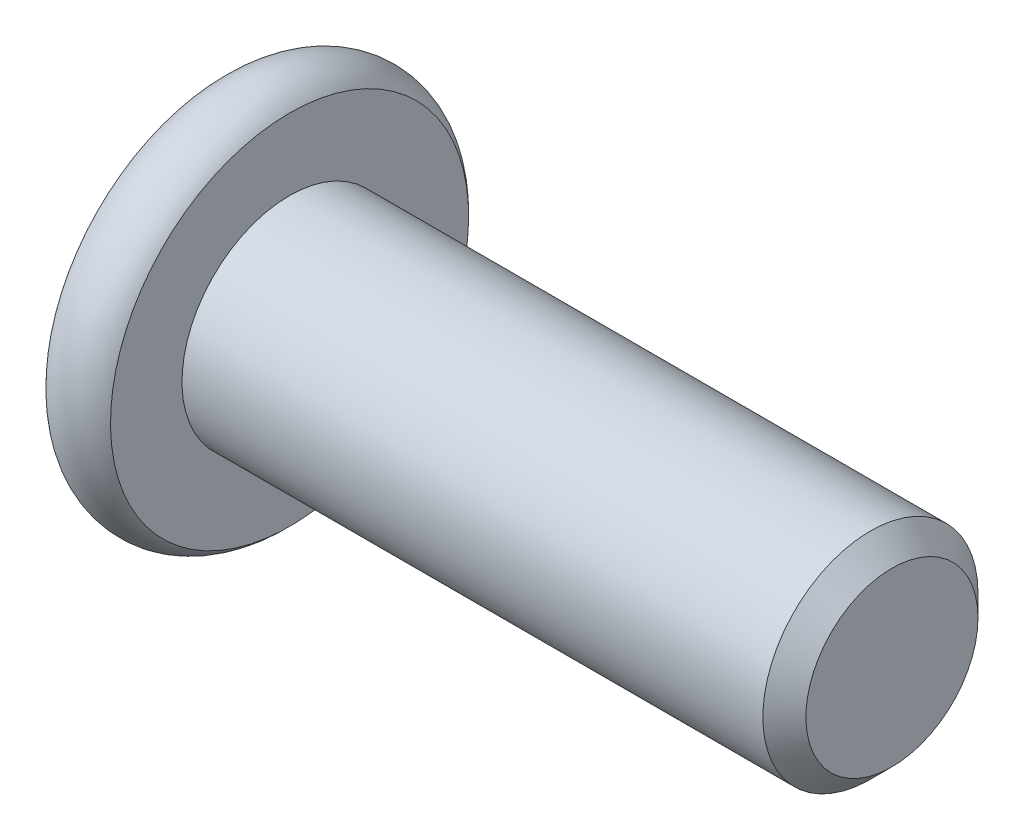
ISO-10303-21;
HEADER;
FILE_DESCRIPTION(('STEP AP214'),'2;1');
FILE_NAME('part.step','',(''),(''),'','','');
FILE_SCHEMA(('AUTOMOTIVE_DESIGN { 1 0 10303 214 1 1 1 1 }'));
ENDSEC;
DATA;
#1=APPLICATION_CONTEXT('core data for automotive mechanical design processes');
#2=APPLICATION_PROTOCOL_DEFINITION('international standard','automotive_design',2000,#1);
#3=PRODUCT_CONTEXT('',#1,'mechanical');
#4=PRODUCT('Part','Part','',(#3));
#5=PRODUCT_RELATED_PRODUCT_CATEGORY('part','',(#4));
#6=PRODUCT_DEFINITION_FORMATION('','',#4);
#7=PRODUCT_DEFINITION_CONTEXT('part definition',#1,'design');
#8=PRODUCT_DEFINITION('design','',#6,#7);
#9=PRODUCT_DEFINITION_SHAPE('','',#8);
#10=(LENGTH_UNIT() NAMED_UNIT(*) SI_UNIT(.MILLI.,.METRE.));
#11=(NAMED_UNIT(*) PLANE_ANGLE_UNIT() SI_UNIT($,.RADIAN.));
#12=(NAMED_UNIT(*) SI_UNIT($,.STERADIAN.) SOLID_ANGLE_UNIT());
#13=UNCERTAINTY_MEASURE_WITH_UNIT(LENGTH_MEASURE(1.E-05),#10,'distance_accuracy_value','');
#14=(GEOMETRIC_REPRESENTATION_CONTEXT(3) GLOBAL_UNCERTAINTY_ASSIGNED_CONTEXT((#13)) GLOBAL_UNIT_ASSIGNED_CONTEXT((#10,
#11,#12)) REPRESENTATION_CONTEXT('',''));
#15=CARTESIAN_POINT('',(0.,0.,0.));
#16=DIRECTION('',(0.,0.,1.));
#17=DIRECTION('',(1.,0.,0.));
#18=AXIS2_PLACEMENT_3D('',#15,#16,#17);
#19=CARTESIAN_POINT('',(-14.,0.,0.));
#20=DIRECTION('',(1.,0.,0.));
#21=DIRECTION('',(0.,0.,-1.));
#22=AXIS2_PLACEMENT_3D('',#19,#20,#21);
#23=CYLINDRICAL_SURFACE('',#22,2.5);
#24=CARTESIAN_POINT('',(-0.500000000000006,0.,0.));
#25=DIRECTION('',(1.,0.,0.));
#26=DIRECTION('',(0.,0.,-1.));
#27=AXIS2_PLACEMENT_3D('',#24,#25,#26);
#28=CIRCLE('',#27,2.5);
#29=CARTESIAN_POINT('',(-0.500000000000006,0.,-2.5));
#30=VERTEX_POINT('',#29);
#31=EDGE_CURVE('E55',#30,#30,#28,.F.);
#32=ORIENTED_EDGE('',*,*,#31,.T.);
#33=EDGE_LOOP('',(#32));
#34=FACE_BOUND('',#33,.T.);
#35=CARTESIAN_POINT('',(-14.,0.,0.));
#36=DIRECTION('',(1.,0.,0.));
#37=DIRECTION('',(0.,1.,0.));
#38=AXIS2_PLACEMENT_3D('',#35,#36,#37);
#39=CIRCLE('',#38,2.5);
#40=CARTESIAN_POINT('',(-14.,2.49999999999999,0.));
#41=VERTEX_POINT('',#40);
#42=EDGE_CURVE('E131',#41,#41,#39,.F.);
#43=ORIENTED_EDGE('',*,*,#42,.F.);
#44=EDGE_LOOP('',(#43));
#45=FACE_BOUND('',#44,.T.);
#46=ADVANCED_FACE('F41',(#34,#45),#23,.T.);
#47=CARTESIAN_POINT('',(0.,0.,0.));
#48=DIRECTION('',(1.,0.,0.));
#49=DIRECTION('',(0.,0.,-1.));
#50=AXIS2_PLACEMENT_3D('',#47,#48,#49);
#51=PLANE('',#50);
#52=CARTESIAN_POINT('',(0.,0.,0.));
#53=DIRECTION('',(1.,0.,0.));
#54=DIRECTION('',(0.,0.,-1.));
#55=AXIS2_PLACEMENT_3D('',#52,#53,#54);
#56=CIRCLE('',#55,1.99999999999999);
#57=CARTESIAN_POINT('',(0.,0.,-1.99999999999999));
#58=VERTEX_POINT('',#57);
#59=EDGE_CURVE('E134',#58,#58,#56,.T.);
#60=ORIENTED_EDGE('',*,*,#59,.T.);
#61=EDGE_LOOP('',(#60));
#62=FACE_BOUND('',#61,.T.);
#63=ADVANCED_FACE('F144',(#62),#51,.T.);
#64=CARTESIAN_POINT('',(0.,0.,0.));
#65=DIRECTION('',(-1.,0.,0.));
#66=DIRECTION('',(0.,0.,1.));
#67=AXIS2_PLACEMENT_3D('',#64,#65,#66);
#68=CONICAL_SURFACE('',#67,1.99999999999999,0.785398163397446);
#69=ORIENTED_EDGE('',*,*,#31,.F.);
#70=EDGE_LOOP('',(#69));
#71=FACE_BOUND('',#70,.T.);
#72=ORIENTED_EDGE('',*,*,#59,.F.);
#73=EDGE_LOOP('',(#72));
#74=FACE_BOUND('',#73,.T.);
#75=ADVANCED_FACE('F43',(#71,#74),#68,.T.);
#76=CARTESIAN_POINT('',(-15.5,0.,0.));
#77=DIRECTION('',(-1.,0.,0.));
#78=DIRECTION('',(0.,-1.,0.));
#79=AXIS2_PLACEMENT_3D('',#76,#77,#78);
#80=PLANE('',#79);
#81=CARTESIAN_POINT('',(-15.5,0.,0.));
#82=DIRECTION('',(-1.,0.,0.));
#83=DIRECTION('',(0.,-1.,0.));
#84=AXIS2_PLACEMENT_3D('',#81,#82,#83);
#85=CIRCLE('',#84,1.78205080756884);
#86=CARTESIAN_POINT('',(-15.5,-1.78205080756878,0.));
#87=VERTEX_POINT('',#86);
#88=EDGE_CURVE('E249',#87,#87,#85,.T.);
#89=ORIENTED_EDGE('',*,*,#88,.F.);
#90=EDGE_LOOP('',(#89));
#91=FACE_BOUND('',#90,.T.);
#92=CARTESIAN_POINT('',(-15.5,0.,0.));
#93=DIRECTION('',(1.,0.,0.));
#94=DIRECTION('',(0.,1.,0.));
#95=AXIS2_PLACEMENT_3D('',#92,#93,#94);
#96=CIRCLE('',#95,4.16143782776615);
#97=CARTESIAN_POINT('',(-15.5,4.16143782776615,0.));
#98=VERTEX_POINT('',#97);
#99=EDGE_CURVE('E128',#98,#98,#96,.T.);
#100=ORIENTED_EDGE('',*,*,#99,.F.);
#101=EDGE_LOOP('',(#100));
#102=FACE_BOUND('',#101,.T.);
#103=ADVANCED_FACE('F143',(#91,#102),#80,.T.);
#104=CARTESIAN_POINT('',(-14.75,0.,0.));
#105=DIRECTION('',(1.,0.,0.));
#106=DIRECTION('',(0.,1.,0.));
#107=AXIS2_PLACEMENT_3D('',#104,#105,#106);
#108=TOROIDAL_SURFACE('',#107,3.5,1.);
#109=ORIENTED_EDGE('',*,*,#99,.T.);
#110=EDGE_LOOP('',(#109));
#111=FACE_BOUND('',#110,.T.);
#112=CARTESIAN_POINT('',(-14.,0.,0.));
#113=DIRECTION('',(1.,0.,0.));
#114=DIRECTION('',(0.,1.,0.));
#115=AXIS2_PLACEMENT_3D('',#112,#113,#114);
#116=CIRCLE('',#115,4.16143782776615);
#117=CARTESIAN_POINT('',(-14.,4.16143782776615,0.));
#118=VERTEX_POINT('',#117);
#119=EDGE_CURVE('E125',#118,#118,#116,.T.);
#120=ORIENTED_EDGE('',*,*,#119,.F.);
#121=EDGE_LOOP('',(#120));
#122=FACE_BOUND('',#121,.T.);
#123=ADVANCED_FACE('F155',(#111,#122),#108,.T.);
#124=CARTESIAN_POINT('',(-14.,4.16143782776615,0.));
#125=DIRECTION('',(1.,0.,0.));
#126=DIRECTION('',(0.,1.,0.));
#127=AXIS2_PLACEMENT_3D('',#124,#125,#126);
#128=PLANE('',#127);
#129=ORIENTED_EDGE('',*,*,#42,.T.);
#130=EDGE_LOOP('',(#129));
#131=FACE_BOUND('',#130,.T.);
#132=ORIENTED_EDGE('',*,*,#119,.T.);
#133=EDGE_LOOP('',(#132));
#134=FACE_BOUND('',#133,.T.);
#135=ADVANCED_FACE('F159',(#131,#134),#128,.T.);
#136=CARTESIAN_POINT('',(-15.5,0.,0.));
#137=DIRECTION('',(-1.,0.,0.));
#138=DIRECTION('',(0.,-1.,0.));
#139=AXIS2_PLACEMENT_3D('',#136,#137,#138);
#140=CONICAL_SURFACE('',#139,1.78205080756884,0.78539816339745);
#141=ORIENTED_EDGE('',*,*,#88,.T.);
#142=EDGE_LOOP('',(#141));
#143=FACE_BOUND('',#142,.T.);
#144=CARTESIAN_POINT('',(-16.015428085613,-1.74023253176574,1.5));
#145=CARTESIAN_POINT('',(-15.9833811073445,-1.69791724929728,1.5));
#146=CARTESIAN_POINT('',(-15.9516444672841,-1.65536760966789,1.5));
#147=CARTESIAN_POINT('',(-15.8889203936153,-1.56970398156682,1.5));
#148=CARTESIAN_POINT('',(-15.85793314822,-1.52658985542846,1.5));
#149=CARTESIAN_POINT('',(-15.765846164345,-1.39562626326561,1.5));
#150=CARTESIAN_POINT('',(-15.7061145123021,-1.30679868010573,1.5));
#151=CARTESIAN_POINT('',(-15.5887342891012,-1.12044622640212,1.5));
#152=CARTESIAN_POINT('',(-15.5314082774823,-1.0227158730667,1.5));
#153=CARTESIAN_POINT('',(-15.426463214976,-0.822357214965234,1.5));
#154=CARTESIAN_POINT('',(-15.3788114236896,-0.719746931701897,1.5));
#155=CARTESIAN_POINT('',(-15.320509988315,-0.565852387095071,1.5));
#156=CARTESIAN_POINT('',(-15.3037990535409,-0.516874191424659,1.5));
#157=CARTESIAN_POINT('',(-15.2743077515089,-0.417723988457498,1.5));
#158=CARTESIAN_POINT('',(-15.2615276514219,-0.367551900263865,1.5));
#159=CARTESIAN_POINT('',(-15.2407784202458,-0.267158299056116,1.5));
#160=CARTESIAN_POINT('',(-15.2327260618259,-0.216954261864853,1.5));
#161=CARTESIAN_POINT('',(-15.221591636834,-0.115994915871319,1.5));
#162=CARTESIAN_POINT('',(-15.2185086886377,-0.0652397064615366,1.5));
#163=CARTESIAN_POINT('',(-15.2175473897404,0.034422223487559,1.5));
#164=CARTESIAN_POINT('',(-15.2194789216952,0.083327170110093,1.5));
#165=CARTESIAN_POINT('',(-15.2280175729677,0.180724293127225,1.5));
#166=CARTESIAN_POINT('',(-15.234625142048,0.229216429361733,1.5));
#167=CARTESIAN_POINT('',(-15.2522650626447,0.326258027697012,1.5));
#168=CARTESIAN_POINT('',(-15.263373168201,0.374793507450032,1.5));
#169=CARTESIAN_POINT('',(-15.2894198669595,0.470802295834186,1.5));
#170=CARTESIAN_POINT('',(-15.3043581560035,0.518275688481289,1.5));
#171=CARTESIAN_POINT('',(-15.356839545716,0.667150562065138,1.5));
#172=CARTESIAN_POINT('',(-15.4003351165442,0.766448362426858,1.5));
#173=CARTESIAN_POINT('',(-15.4970587814836,0.960384405673845,1.5));
#174=CARTESIAN_POINT('',(-15.5503217226675,1.05500437383622,1.5));
#175=CARTESIAN_POINT('',(-15.6602258010454,1.23584520321533,1.5));
#176=CARTESIAN_POINT('',(-15.7165682531046,1.32224986946551,1.5));
#177=CARTESIAN_POINT('',(-15.803675572597,1.44954953726474,1.5));
#178=CARTESIAN_POINT('',(-15.8330199906839,1.49143368482424,1.5));
#179=CARTESIAN_POINT('',(-15.8924869182931,1.57462914783245,1.5));
#180=CARTESIAN_POINT('',(-15.9226092115007,1.6159406177258,1.5));
#181=CARTESIAN_POINT('',(-15.9530541181366,1.65701358742554,1.5));
#182=B_SPLINE_CURVE_WITH_KNOTS('',3,(#144,#145,#146,#147,#148,#149,#150,#151,#152,#153,#154,
#155,#156,#157,#158,#159,#160,#161,#162,#163,#164,#165,#166,#167,#168,#169,#170,#171,#172,#173,
#174,#175,#176,#177,#178,#179,#180,#181),.UNSPECIFIED.,.F.,.F.,(4,2,2,2,2,2,2,2,2,2,2,2,2,2,2,2,
2,2,4),(0.,0.159238974218353,0.318517535014539,0.639504781932382,0.97913789379919,
1.31760168934356,1.47272233841623,1.62785352839774,1.78016486537345,1.93244917778278,
2.07904486260296,2.22565464958331,2.37484213303397,2.52401777304038,2.84828365283774,
3.17372975666748,3.48303030530535,3.63644667013907,3.78982082222911),.UNSPECIFIED.);
#183=CARTESIAN_POINT('',(-15.45,-0.86602540378438,1.5));
#184=VERTEX_POINT('',#183);
#185=CARTESIAN_POINT('',(-15.45,0.866025403784498,1.5));
#186=VERTEX_POINT('',#185);
#187=EDGE_CURVE('E109',#184,#186,#182,.T.);
#188=ORIENTED_EDGE('',*,*,#187,.F.);
#189=CARTESIAN_POINT('',(-15.4501154816001,-1.73216627762266,-0.000200000000000743));
#190=CARTESIAN_POINT('',(-15.4203654760674,-1.70239359975909,0.0513677907370745));
#191=CARTESIAN_POINT('',(-15.3923624839103,-1.67212305186349,0.1037979176652));
#192=CARTESIAN_POINT('',(-15.3410892304402,-1.61039789003613,0.210709034055596));
#193=CARTESIAN_POINT('',(-15.3178475050444,-1.57893740312608,0.26520019581466));
#194=CARTESIAN_POINT('',(-15.2780337289923,-1.51549879897981,0.375079081357248));
#195=CARTESIAN_POINT('',(-15.2613615856709,-1.48353684526804,0.430438809095199));
#196=CARTESIAN_POINT('',(-15.2356744568181,-1.41890915196206,0.54237725747715));
#197=CARTESIAN_POINT('',(-15.2266402904789,-1.38624538781112,0.598952556553007));
#198=CARTESIAN_POINT('',(-15.2184890812269,-1.32995210095294,0.696455389516439));
#199=CARTESIAN_POINT('',(-15.2172822529892,-1.30639533311118,0.737256908280465));
#200=CARTESIAN_POINT('',(-15.2193140571623,-1.25932335290188,0.818787969615857));
#201=CARTESIAN_POINT('',(-15.2225536707483,-1.23580815085308,0.859517494314628));
#202=CARTESIAN_POINT('',(-15.233291985982,-1.18900414978421,0.940584402163415));
#203=CARTESIAN_POINT('',(-15.2407946530188,-1.16571558211714,0.980921384598287));
#204=CARTESIAN_POINT('',(-15.2596516119283,-1.11952932016329,1.06091833691403));
#205=CARTESIAN_POINT('',(-15.2710075570186,-1.0966317980878,1.10057800851621));
#206=CARTESIAN_POINT('',(-15.3047216475927,-1.03798159809693,1.20216313477448));
#207=CARTESIAN_POINT('',(-15.3296218490934,-1.00259267147459,1.26345855370969));
#208=CARTESIAN_POINT('',(-15.3716566532716,-0.950557780604316,1.35358562846331));
#209=CARTESIAN_POINT('',(-15.3864251535591,-0.933410759677089,1.38328513990772));
#210=CARTESIAN_POINT('',(-15.4173105659402,-0.899432101996348,1.44213790138375));
#211=CARTESIAN_POINT('',(-15.4334268341217,-0.882600319285652,1.47129140422064));
#212=CARTESIAN_POINT('',(-15.4501154816001,-0.865909933730542,1.5002));
#213=B_SPLINE_CURVE_WITH_KNOTS('',3,(#189,#190,#191,#192,#193,#194,#195,#196,#197,#198,#199,
#200,#201,#202,#203,#204,#205,#206,#207,#208,#209,#210,#211,#212),.UNSPECIFIED.,.F.,.F.,(4,2,2,
2,2,2,2,2,2,2,2,4),(0.,0.199829143693305,0.400822987382389,0.598623720538181,0.795926240188889,
0.937113067959881,1.07833105577193,1.21968061668222,1.36109089931054,1.58570969637565,
1.69770705470964,1.80965120737194),.UNSPECIFIED.);
#214=CARTESIAN_POINT('',(-15.45,-1.73205080756882,0.));
#215=VERTEX_POINT('',#214);
#216=EDGE_CURVE('E205',#215,#184,#213,.T.);
#217=ORIENTED_EDGE('',*,*,#216,.F.);
#218=CARTESIAN_POINT('',(-15.4501154816001,-0.865909933730541,-1.5002));
#219=CARTESIAN_POINT('',(-15.4203654760674,-0.895682611594106,-1.44863220926292));
#220=CARTESIAN_POINT('',(-15.3923624839103,-0.925953159489705,-1.3962020823348));
#221=CARTESIAN_POINT('',(-15.3410892304402,-0.987678321317064,-1.2892909659444));
#222=CARTESIAN_POINT('',(-15.3178475050444,-1.01913880822712,-1.23479980418534));
#223=CARTESIAN_POINT('',(-15.2780337289923,-1.08257741237338,-1.12492091864275));
#224=CARTESIAN_POINT('',(-15.2613615856709,-1.11453936608515,-1.0695611909048));
#225=CARTESIAN_POINT('',(-15.2356744568181,-1.17916705939114,-0.95762274252285));
#226=CARTESIAN_POINT('',(-15.2266402904789,-1.21183082354207,-0.901047443446992));
#227=CARTESIAN_POINT('',(-15.2184890812269,-1.26812411040026,-0.80354461048356));
#228=CARTESIAN_POINT('',(-15.2172822529892,-1.29168087824202,-0.762743091719535));
#229=CARTESIAN_POINT('',(-15.2193140571623,-1.33875285845132,-0.681212030384143));
#230=CARTESIAN_POINT('',(-15.2225536707483,-1.36226806050012,-0.640482505685371));
#231=CARTESIAN_POINT('',(-15.233291985982,-1.40907206156899,-0.559415597836585));
#232=CARTESIAN_POINT('',(-15.2407946530188,-1.43236062923606,-0.519078615401713));
#233=CARTESIAN_POINT('',(-15.2596516119283,-1.4785468911899,-0.439081663085971));
#234=CARTESIAN_POINT('',(-15.2710075570186,-1.50144441326539,-0.399421991483793));
#235=CARTESIAN_POINT('',(-15.3047216475927,-1.56009461325627,-0.297836865225516));
#236=CARTESIAN_POINT('',(-15.3296218490934,-1.5954835398786,-0.236541446290312));
#237=CARTESIAN_POINT('',(-15.3716566532716,-1.64751843074888,-0.146414371536687));
#238=CARTESIAN_POINT('',(-15.3864251535591,-1.66466545167611,-0.116714860092283));
#239=CARTESIAN_POINT('',(-15.4173105659402,-1.69864410935685,-0.0578620986162489));
#240=CARTESIAN_POINT('',(-15.4334268341217,-1.71547589206755,-0.0287085957793625));
#241=CARTESIAN_POINT('',(-15.4501154816001,-1.73216627762266,0.000200000000000135));
#242=B_SPLINE_CURVE_WITH_KNOTS('',3,(#218,#219,#220,#221,#222,#223,#224,#225,#226,#227,#228,
#229,#230,#231,#232,#233,#234,#235,#236,#237,#238,#239,#240,#241),.UNSPECIFIED.,.F.,.F.,(4,2,2,
2,2,2,2,2,2,2,2,4),(0.,0.199829143693305,0.400822987382388,0.59862372053818,0.795926240188888,
0.93711306795988,1.07833105577193,1.21968061668222,1.36109089931054,1.58570969637565,
1.69770705470964,1.80965120737194),.UNSPECIFIED.);
#243=CARTESIAN_POINT('',(-15.45,-0.866025403784379,-1.5));
#244=VERTEX_POINT('',#243);
#245=EDGE_CURVE('E199',#244,#215,#242,.T.);
#246=ORIENTED_EDGE('',*,*,#245,.F.);
#247=CARTESIAN_POINT('',(-16.015428085613,-1.74023253176574,-1.5));
#248=CARTESIAN_POINT('',(-15.9833811073445,-1.69791724929728,-1.5));
#249=CARTESIAN_POINT('',(-15.9516444672841,-1.65536760966789,-1.5));
#250=CARTESIAN_POINT('',(-15.8889203936153,-1.56970398156682,-1.5));
#251=CARTESIAN_POINT('',(-15.85793314822,-1.52658985542846,-1.5));
#252=CARTESIAN_POINT('',(-15.765846164345,-1.3956262632656,-1.5));
#253=CARTESIAN_POINT('',(-15.7061145123021,-1.30679868010573,-1.5));
#254=CARTESIAN_POINT('',(-15.5887342891012,-1.12044622640212,-1.5));
#255=CARTESIAN_POINT('',(-15.5314082774823,-1.0227158730667,-1.5));
#256=CARTESIAN_POINT('',(-15.426463214976,-0.822357214965232,-1.5));
#257=CARTESIAN_POINT('',(-15.3788114236896,-0.719746931701896,-1.5));
#258=CARTESIAN_POINT('',(-15.320509988315,-0.565852387095069,-1.5));
#259=CARTESIAN_POINT('',(-15.3037990535409,-0.516874191424658,-1.5));
#260=CARTESIAN_POINT('',(-15.2743077515089,-0.417723988457497,-1.5));
#261=CARTESIAN_POINT('',(-15.2615276514219,-0.367551900263864,-1.5));
#262=CARTESIAN_POINT('',(-15.2407784202458,-0.267158299056116,-1.5));
#263=CARTESIAN_POINT('',(-15.2327260618259,-0.216954261864852,-1.5));
#264=CARTESIAN_POINT('',(-15.221591636834,-0.115994915871318,-1.5));
#265=CARTESIAN_POINT('',(-15.2185086886377,-0.0652397064615364,-1.5));
#266=CARTESIAN_POINT('',(-15.2175473897404,0.0344222234875589,-1.5));
#267=CARTESIAN_POINT('',(-15.2194789216952,0.0833271701100929,-1.5));
#268=CARTESIAN_POINT('',(-15.2280175729677,0.180724293127225,-1.5));
#269=CARTESIAN_POINT('',(-15.234625142048,0.229216429361733,-1.5));
#270=CARTESIAN_POINT('',(-15.2522650626447,0.326258027697012,-1.5));
#271=CARTESIAN_POINT('',(-15.263373168201,0.374793507450032,-1.5));
#272=CARTESIAN_POINT('',(-15.2894198669595,0.470802295834185,-1.5));
#273=CARTESIAN_POINT('',(-15.3043581560035,0.518275688481288,-1.5));
#274=CARTESIAN_POINT('',(-15.356839545716,0.667150562065137,-1.5));
#275=CARTESIAN_POINT('',(-15.4003351165442,0.766448362426856,-1.5));
#276=CARTESIAN_POINT('',(-15.4970587814836,0.960384405673843,-1.5));
#277=CARTESIAN_POINT('',(-15.5503217226675,1.05500437383622,-1.5));
#278=CARTESIAN_POINT('',(-15.6602258010454,1.23584520321533,-1.5));
#279=CARTESIAN_POINT('',(-15.7165682531046,1.32224986946551,-1.5));
#280=CARTESIAN_POINT('',(-15.803675572597,1.44954953726474,-1.5));
#281=CARTESIAN_POINT('',(-15.8330199906839,1.49143368482424,-1.5));
#282=CARTESIAN_POINT('',(-15.8924869182931,1.57462914783245,-1.5));
#283=CARTESIAN_POINT('',(-15.9226092115007,1.6159406177258,-1.5));
#284=CARTESIAN_POINT('',(-15.9530541181366,1.65701358742554,-1.5));
#285=B_SPLINE_CURVE_WITH_KNOTS('',3,(#247,#248,#249,#250,#251,#252,#253,#254,#255,#256,#257,
#258,#259,#260,#261,#262,#263,#264,#265,#266,#267,#268,#269,#270,#271,#272,#273,#274,#275,#276,
#277,#278,#279,#280,#281,#282,#283,#284),.UNSPECIFIED.,.F.,.F.,(4,2,2,2,2,2,2,2,2,2,2,2,2,2,2,2,
2,2,4),(0.,0.159238974218351,0.31851753501454,0.639504781932383,0.979137893799188,
1.31760168934356,1.47272233841622,1.62785352839774,1.78016486537345,1.93244917778277,
2.07904486260295,2.2256546495833,2.37484213303397,2.52401777304037,2.84828365283773,
3.17372975666748,3.48303030530535,3.63644667013906,3.7898208222291),.UNSPECIFIED.);
#286=CARTESIAN_POINT('',(-15.45,0.866025403784498,-1.5));
#287=VERTEX_POINT('',#286);
#288=EDGE_CURVE('E62',#287,#244,#285,.F.);
#289=ORIENTED_EDGE('',*,*,#288,.F.);
#290=CARTESIAN_POINT('',(-15.4501154816001,1.73216627762277,0.000200000000000631));
#291=CARTESIAN_POINT('',(-15.4203654760673,1.70239359975921,-0.051367790737075));
#292=CARTESIAN_POINT('',(-15.3923624839103,1.67212305186361,-0.1037979176652));
#293=CARTESIAN_POINT('',(-15.3410892304402,1.61039789003625,-0.210709034055596));
#294=CARTESIAN_POINT('',(-15.3178475050444,1.5789374031262,-0.265200195814661));
#295=CARTESIAN_POINT('',(-15.2780337289922,1.51549879897993,-0.375079081357248));
#296=CARTESIAN_POINT('',(-15.2613615856709,1.48353684526816,-0.430438809095199));
#297=CARTESIAN_POINT('',(-15.2356744568181,1.41890915196217,-0.542377257477151));
#298=CARTESIAN_POINT('',(-15.2266402904789,1.38624538781124,-0.598952556553009));
#299=CARTESIAN_POINT('',(-15.2184890812269,1.32995210095305,-0.696455389516441));
#300=CARTESIAN_POINT('',(-15.2172822529892,1.3063953331113,-0.737256908280466));
#301=CARTESIAN_POINT('',(-15.2193140571623,1.25932335290199,-0.818787969615858));
#302=CARTESIAN_POINT('',(-15.2225536707483,1.23580815085319,-0.85951749431463));
#303=CARTESIAN_POINT('',(-15.233291985982,1.18900414978432,-0.940584402163416));
#304=CARTESIAN_POINT('',(-15.2407946530188,1.16571558211725,-0.980921384598288));
#305=CARTESIAN_POINT('',(-15.2596516119283,1.11952932016341,-1.06091833691403));
#306=CARTESIAN_POINT('',(-15.2710075570186,1.09663179808792,-1.10057800851621));
#307=CARTESIAN_POINT('',(-15.3047216475927,1.03798159809704,-1.20216313477448));
#308=CARTESIAN_POINT('',(-15.3296218490934,1.00259267147471,-1.26345855370969));
#309=CARTESIAN_POINT('',(-15.3716566532716,0.950557780604434,-1.35358562846331));
#310=CARTESIAN_POINT('',(-15.3864251535591,0.933410759677207,-1.38328513990772));
#311=CARTESIAN_POINT('',(-15.4173105659402,0.899432101996466,-1.44213790138375));
#312=CARTESIAN_POINT('',(-15.4334268341217,0.88260031928577,-1.47129140422064));
#313=CARTESIAN_POINT('',(-15.4501154816001,0.865909933730661,-1.5002));
#314=B_SPLINE_CURVE_WITH_KNOTS('',3,(#290,#291,#292,#293,#294,#295,#296,#297,#298,#299,#300,
#301,#302,#303,#304,#305,#306,#307,#308,#309,#310,#311,#312,#313),.UNSPECIFIED.,.F.,.F.,(4,2,2,
2,2,2,2,2,2,2,2,4),(0.,0.199829143693305,0.400822987382389,0.598623720538182,0.79592624018889,
0.937113067959882,1.07833105577193,1.21968061668222,1.36109089931055,1.58570969637566,
1.69770705470964,1.80965120737194),.UNSPECIFIED.);
#315=CARTESIAN_POINT('',(-15.45,1.73205080756894,0.));
#316=VERTEX_POINT('',#315);
#317=EDGE_CURVE('E11',#316,#287,#314,.T.);
#318=ORIENTED_EDGE('',*,*,#317,.F.);
#319=CARTESIAN_POINT('',(-15.4501154816001,0.86590993373066,1.5002));
#320=CARTESIAN_POINT('',(-15.4203654760674,0.895682611594225,1.44863220926292));
#321=CARTESIAN_POINT('',(-15.3923624839103,0.925953159489824,1.3962020823348));
#322=CARTESIAN_POINT('',(-15.3410892304402,0.987678321317183,1.2892909659444));
#323=CARTESIAN_POINT('',(-15.3178475050444,1.01913880822723,1.23479980418534));
#324=CARTESIAN_POINT('',(-15.2780337289922,1.0825774123735,1.12492091864275));
#325=CARTESIAN_POINT('',(-15.2613615856709,1.11453936608527,1.0695611909048));
#326=CARTESIAN_POINT('',(-15.2356744568181,1.17916705939126,0.957622742522848));
#327=CARTESIAN_POINT('',(-15.2266402904789,1.21183082354219,0.90104744344699));
#328=CARTESIAN_POINT('',(-15.2184890812269,1.26812411040038,0.803544610483558));
#329=CARTESIAN_POINT('',(-15.2172822529892,1.29168087824214,0.762743091719532));
#330=CARTESIAN_POINT('',(-15.2193140571623,1.33875285845144,0.68121203038414));
#331=CARTESIAN_POINT('',(-15.2225536707483,1.36226806050024,0.640482505685369));
#332=CARTESIAN_POINT('',(-15.233291985982,1.40907206156911,0.559415597836583));
#333=CARTESIAN_POINT('',(-15.2407946530188,1.43236062923618,0.519078615401711));
#334=CARTESIAN_POINT('',(-15.2596516119283,1.47854689119002,0.439081663085968));
#335=CARTESIAN_POINT('',(-15.2710075570186,1.50144441326551,0.399421991483791));
#336=CARTESIAN_POINT('',(-15.3047216475927,1.56009461325639,0.297836865225514));
#337=CARTESIAN_POINT('',(-15.3296218490934,1.59548353987872,0.236541446290311));
#338=CARTESIAN_POINT('',(-15.3716566532716,1.647518430749,0.146414371536687));
#339=CARTESIAN_POINT('',(-15.3864251535591,1.66466545167623,0.116714860092283));
#340=CARTESIAN_POINT('',(-15.4173105659402,1.69864410935697,0.0578620986162501));
#341=CARTESIAN_POINT('',(-15.4334268341217,1.71547589206766,0.0287085957793638));
#342=CARTESIAN_POINT('',(-15.4501154816001,1.73216627762277,-0.000199999999998915));
#343=B_SPLINE_CURVE_WITH_KNOTS('',3,(#319,#320,#321,#322,#323,#324,#325,#326,#327,#328,#329,
#330,#331,#332,#333,#334,#335,#336,#337,#338,#339,#340,#341,#342),.UNSPECIFIED.,.F.,.F.,(4,2,2,
2,2,2,2,2,2,2,2,4),(0.,0.199829143693305,0.400822987382389,0.598623720538182,0.79592624018889,
0.937113067959882,1.07833105577193,1.21968061668222,1.36109089931054,1.58570969637565,
1.69770705470963,1.80965120737193),.UNSPECIFIED.);
#344=EDGE_CURVE('E100',#186,#316,#343,.T.);
#345=ORIENTED_EDGE('',*,*,#344,.F.);
#346=EDGE_LOOP('',(#188,#217,#246,#289,#318,#345));
#347=FACE_BOUND('',#346,.T.);
#348=ADVANCED_FACE('F99',(#143,#347),#140,.F.);
#349=CARTESIAN_POINT('',(-13.2,0.,0.));
#350=DIRECTION('',(-1.,0.,0.));
#351=DIRECTION('',(0.,-1.,0.));
#352=AXIS2_PLACEMENT_3D('',#349,#350,#351);
#353=PLANE('',#352);
#354=DIRECTION('',(0.,0.5,-0.866025403784438));
#355=VECTOR('',#354,1.);
#356=CARTESIAN_POINT('',(-13.2,0.866025403784489,1.5));
#357=LINE('',#356,#355);
#358=CARTESIAN_POINT('',(-13.2,0.866025403784489,1.5));
#359=VERTEX_POINT('',#358);
#360=CARTESIAN_POINT('',(-13.2,1.73205080756893,0.));
#361=VERTEX_POINT('',#360);
#362=EDGE_CURVE('E108',#359,#361,#357,.T.);
#363=ORIENTED_EDGE('',*,*,#362,.T.);
#364=DIRECTION('',(0.,-0.5,-0.866025403784439));
#365=VECTOR('',#364,1.);
#366=CARTESIAN_POINT('',(-13.2,1.73205080756893,0.));
#367=LINE('',#366,#365);
#368=CARTESIAN_POINT('',(-13.2,0.866025403784489,-1.5));
#369=VERTEX_POINT('',#368);
#370=EDGE_CURVE('E113',#361,#369,#367,.T.);
#371=ORIENTED_EDGE('',*,*,#370,.T.);
#372=DIRECTION('',(0.,-1.,0.));
#373=VECTOR('',#372,1.);
#374=CARTESIAN_POINT('',(-13.2,0.866025403784489,-1.5));
#375=LINE('',#374,#373);
#376=CARTESIAN_POINT('',(-13.2,-0.866025403784388,-1.5));
#377=VERTEX_POINT('',#376);
#378=EDGE_CURVE('E231',#369,#377,#375,.T.);
#379=ORIENTED_EDGE('',*,*,#378,.T.);
#380=DIRECTION('',(0.,-0.5,0.866025403784438));
#381=VECTOR('',#380,1.);
#382=CARTESIAN_POINT('',(-13.2,-0.866025403784388,-1.5));
#383=LINE('',#382,#381);
#384=CARTESIAN_POINT('',(-13.2,-1.73205080756883,0.));
#385=VERTEX_POINT('',#384);
#386=EDGE_CURVE('E235',#377,#385,#383,.T.);
#387=ORIENTED_EDGE('',*,*,#386,.T.);
#388=DIRECTION('',(0.,0.5,0.866025403784439));
#389=VECTOR('',#388,1.);
#390=CARTESIAN_POINT('',(-13.2,-1.73205080756883,0.));
#391=LINE('',#390,#389);
#392=CARTESIAN_POINT('',(-13.2,-0.866025403784389,1.5));
#393=VERTEX_POINT('',#392);
#394=EDGE_CURVE('E121',#385,#393,#391,.T.);
#395=ORIENTED_EDGE('',*,*,#394,.T.);
#396=DIRECTION('',(0.,1.,0.));
#397=VECTOR('',#396,1.);
#398=CARTESIAN_POINT('',(-13.2,-0.866025403784389,1.5));
#399=LINE('',#398,#397);
#400=EDGE_CURVE('E116',#393,#359,#399,.T.);
#401=ORIENTED_EDGE('',*,*,#400,.T.);
#402=EDGE_LOOP('',(#363,#371,#379,#387,#395,#401));
#403=FACE_BOUND('',#402,.T.);
#404=ADVANCED_FACE('F185',(#403),#353,.T.);
#405=CARTESIAN_POINT('',(-13.2,1.73205080756893,0.));
#406=DIRECTION('',(0.,0.866025403784439,-0.5));
#407=DIRECTION('',(0.,0.5,0.866025403784439));
#408=AXIS2_PLACEMENT_3D('',#405,#406,#407);
#409=PLANE('',#408);
#410=DIRECTION('',(-1.,0.,0.));
#411=VECTOR('',#410,1.);
#412=CARTESIAN_POINT('',(-13.2,1.73205080756893,0.));
#413=LINE('',#412,#411);
#414=EDGE_CURVE('E106',#361,#316,#413,.T.);
#415=ORIENTED_EDGE('',*,*,#414,.T.);
#416=ORIENTED_EDGE('',*,*,#317,.T.);
#417=DIRECTION('',(-1.,0.,0.));
#418=VECTOR('',#417,1.);
#419=CARTESIAN_POINT('',(-13.2,0.866025403784489,-1.5));
#420=LINE('',#419,#418);
#421=EDGE_CURVE('E115',#369,#287,#420,.T.);
#422=ORIENTED_EDGE('',*,*,#421,.F.);
#423=ORIENTED_EDGE('',*,*,#370,.F.);
#424=EDGE_LOOP('',(#415,#416,#422,#423));
#425=FACE_BOUND('',#424,.T.);
#426=ADVANCED_FACE('F111',(#425),#409,.F.);
#427=CARTESIAN_POINT('',(-13.2,0.866025403784489,-1.5));
#428=DIRECTION('',(0.,0.,-1.));
#429=DIRECTION('',(-1.,0.,0.));
#430=AXIS2_PLACEMENT_3D('',#427,#428,#429);
#431=PLANE('',#430);
#432=ORIENTED_EDGE('',*,*,#421,.T.);
#433=ORIENTED_EDGE('',*,*,#288,.T.);
#434=DIRECTION('',(-1.,0.,0.));
#435=VECTOR('',#434,1.);
#436=CARTESIAN_POINT('',(-13.2,-0.866025403784388,-1.5));
#437=LINE('',#436,#435);
#438=EDGE_CURVE('E118',#377,#244,#437,.T.);
#439=ORIENTED_EDGE('',*,*,#438,.F.);
#440=ORIENTED_EDGE('',*,*,#378,.F.);
#441=EDGE_LOOP('',(#432,#433,#439,#440));
#442=FACE_BOUND('',#441,.T.);
#443=ADVANCED_FACE('F220',(#442),#431,.F.);
#444=CARTESIAN_POINT('',(-13.2,-0.866025403784388,-1.5));
#445=DIRECTION('',(0.,-0.866025403784439,-0.5));
#446=DIRECTION('',(0.,0.5,-0.866025403784439));
#447=AXIS2_PLACEMENT_3D('',#444,#445,#446);
#448=PLANE('',#447);
#449=ORIENTED_EDGE('',*,*,#438,.T.);
#450=ORIENTED_EDGE('',*,*,#245,.T.);
#451=DIRECTION('',(-1.,0.,0.));
#452=VECTOR('',#451,1.);
#453=CARTESIAN_POINT('',(-13.2,-1.73205080756883,0.));
#454=LINE('',#453,#452);
#455=EDGE_CURVE('E245',#385,#215,#454,.T.);
#456=ORIENTED_EDGE('',*,*,#455,.F.);
#457=ORIENTED_EDGE('',*,*,#386,.F.);
#458=EDGE_LOOP('',(#449,#450,#456,#457));
#459=FACE_BOUND('',#458,.T.);
#460=ADVANCED_FACE('F215',(#459),#448,.F.);
#461=CARTESIAN_POINT('',(-13.2,-1.73205080756883,0.));
#462=DIRECTION('',(0.,-0.866025403784439,0.5));
#463=DIRECTION('',(0.,-0.5,-0.866025403784439));
#464=AXIS2_PLACEMENT_3D('',#461,#462,#463);
#465=PLANE('',#464);
#466=ORIENTED_EDGE('',*,*,#455,.T.);
#467=ORIENTED_EDGE('',*,*,#216,.T.);
#468=DIRECTION('',(-1.,0.,0.));
#469=VECTOR('',#468,1.);
#470=CARTESIAN_POINT('',(-13.2,-0.866025403784389,1.5));
#471=LINE('',#470,#469);
#472=EDGE_CURVE('E242',#393,#184,#471,.T.);
#473=ORIENTED_EDGE('',*,*,#472,.F.);
#474=ORIENTED_EDGE('',*,*,#394,.F.);
#475=EDGE_LOOP('',(#466,#467,#473,#474));
#476=FACE_BOUND('',#475,.T.);
#477=ADVANCED_FACE('F212',(#476),#465,.F.);
#478=CARTESIAN_POINT('',(-13.2,-0.866025403784389,1.5));
#479=DIRECTION('',(0.,0.,1.));
#480=DIRECTION('',(1.,0.,0.));
#481=AXIS2_PLACEMENT_3D('',#478,#479,#480);
#482=PLANE('',#481);
#483=ORIENTED_EDGE('',*,*,#472,.T.);
#484=ORIENTED_EDGE('',*,*,#187,.T.);
#485=DIRECTION('',(-1.,0.,0.));
#486=VECTOR('',#485,1.);
#487=CARTESIAN_POINT('',(-13.2,0.866025403784489,1.5));
#488=LINE('',#487,#486);
#489=EDGE_CURVE('E69',#359,#186,#488,.T.);
#490=ORIENTED_EDGE('',*,*,#489,.F.);
#491=ORIENTED_EDGE('',*,*,#400,.F.);
#492=EDGE_LOOP('',(#483,#484,#490,#491));
#493=FACE_BOUND('',#492,.T.);
#494=ADVANCED_FACE('F166',(#493),#482,.F.);
#495=CARTESIAN_POINT('',(-13.2,0.866025403784489,1.5));
#496=DIRECTION('',(0.,0.866025403784439,0.5));
#497=DIRECTION('',(0.,-0.5,0.866025403784439));
#498=AXIS2_PLACEMENT_3D('',#495,#496,#497);
#499=PLANE('',#498);
#500=ORIENTED_EDGE('',*,*,#489,.T.);
#501=ORIENTED_EDGE('',*,*,#344,.T.);
#502=ORIENTED_EDGE('',*,*,#414,.F.);
#503=ORIENTED_EDGE('',*,*,#362,.F.);
#504=EDGE_LOOP('',(#500,#501,#502,#503));
#505=FACE_BOUND('',#504,.T.);
#506=ADVANCED_FACE('F105',(#505),#499,.F.);
#507=CLOSED_SHELL('',(#46,#63,#75,#103,#123,#135,#348,#404,#426,#443,#460,#477,#494,#506));
#508=MANIFOLD_SOLID_BREP('B2',#507);
#509=ADVANCED_BREP_SHAPE_REPRESENTATION('',(#18,#508),#14);
#510=SHAPE_DEFINITION_REPRESENTATION(#9,#509);
ENDSEC;
END-ISO-10303-21;
